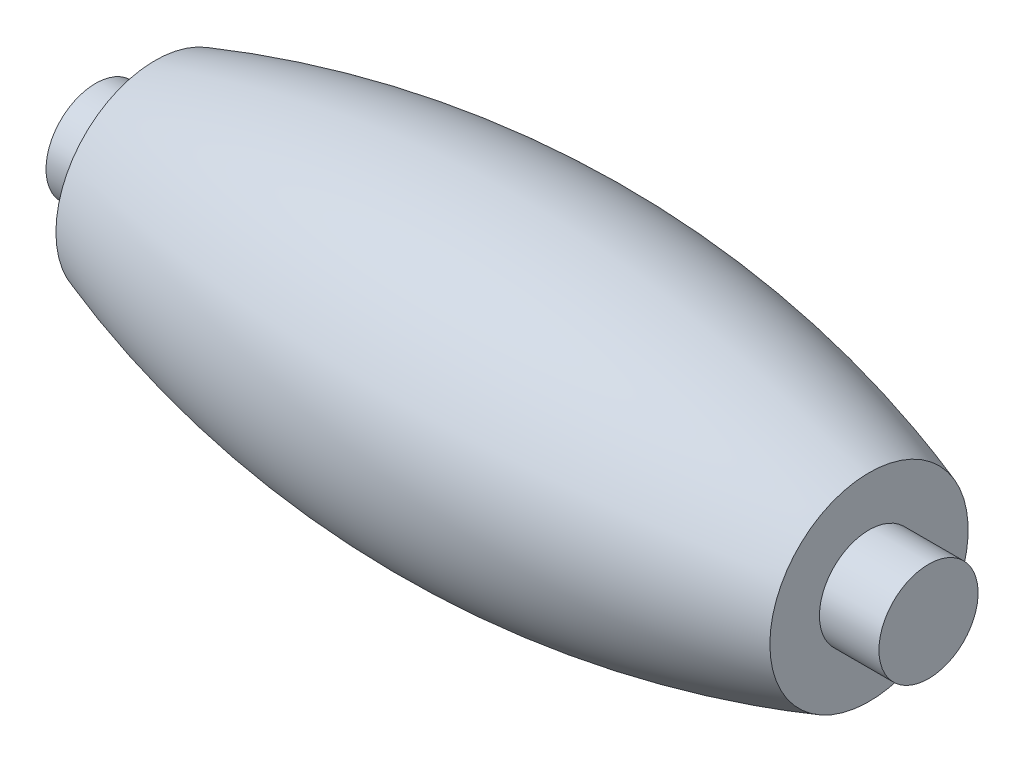
ISO-10303-21;
HEADER;
FILE_DESCRIPTION(('STEP AP214'),'2;1');
FILE_NAME('part.step','',(''),(''),'','','');
FILE_SCHEMA(('AUTOMOTIVE_DESIGN { 1 0 10303 214 1 1 1 1 }'));
ENDSEC;
DATA;
#1=APPLICATION_CONTEXT('core data for automotive mechanical design processes');
#2=APPLICATION_PROTOCOL_DEFINITION('international standard','automotive_design',2000,#1);
#3=PRODUCT_CONTEXT('',#1,'mechanical');
#4=PRODUCT('Part','Part','',(#3));
#5=PRODUCT_RELATED_PRODUCT_CATEGORY('part','',(#4));
#6=PRODUCT_DEFINITION_FORMATION('','',#4);
#7=PRODUCT_DEFINITION_CONTEXT('part definition',#1,'design');
#8=PRODUCT_DEFINITION('design','',#6,#7);
#9=PRODUCT_DEFINITION_SHAPE('','',#8);
#10=(LENGTH_UNIT() NAMED_UNIT(*) SI_UNIT(.MILLI.,.METRE.));
#11=(NAMED_UNIT(*) PLANE_ANGLE_UNIT() SI_UNIT($,.RADIAN.));
#12=(NAMED_UNIT(*) SI_UNIT($,.STERADIAN.) SOLID_ANGLE_UNIT());
#13=UNCERTAINTY_MEASURE_WITH_UNIT(LENGTH_MEASURE(1.E-05),#10,'distance_accuracy_value','');
#14=(GEOMETRIC_REPRESENTATION_CONTEXT(3) GLOBAL_UNCERTAINTY_ASSIGNED_CONTEXT((#13)) GLOBAL_UNIT_ASSIGNED_CONTEXT((#10,
#11,#12)) REPRESENTATION_CONTEXT('',''));
#15=CARTESIAN_POINT('',(0.,0.,0.));
#16=DIRECTION('',(0.,0.,1.));
#17=DIRECTION('',(1.,0.,0.));
#18=AXIS2_PLACEMENT_3D('',#15,#16,#17);
#19=CARTESIAN_POINT('',(0.,0.,0.));
#20=DIRECTION('',(1.,0.,0.));
#21=DIRECTION('',(0.,0.,-1.));
#22=AXIS2_PLACEMENT_3D('',#19,#20,#21);
#23=PLANE('',#22);
#24=CARTESIAN_POINT('',(0.,0.,0.));
#25=DIRECTION('',(-1.,0.,0.));
#26=DIRECTION('',(0.,0.,1.));
#27=AXIS2_PLACEMENT_3D('',#24,#25,#26);
#28=CIRCLE('',#27,2.5);
#29=CARTESIAN_POINT('',(0.,0.,2.5));
#30=VERTEX_POINT('',#29);
#31=EDGE_CURVE('E10',#30,#30,#28,.T.);
#32=ORIENTED_EDGE('',*,*,#31,.T.);
#33=EDGE_LOOP('',(#32));
#34=FACE_BOUND('',#33,.T.);
#35=ADVANCED_FACE('F39',(#34),#23,.F.);
#36=CARTESIAN_POINT('',(0.,0.,0.));
#37=DIRECTION('',(-1.,0.,0.));
#38=DIRECTION('',(0.,0.,1.));
#39=AXIS2_PLACEMENT_3D('',#36,#37,#38);
#40=CYLINDRICAL_SURFACE('',#39,2.5);
#41=ORIENTED_EDGE('',*,*,#31,.F.);
#42=EDGE_LOOP('',(#41));
#43=FACE_BOUND('',#42,.T.);
#44=CARTESIAN_POINT('',(3.,0.,0.));
#45=DIRECTION('',(-1.,0.,0.));
#46=DIRECTION('',(0.,0.,1.));
#47=AXIS2_PLACEMENT_3D('',#44,#45,#46);
#48=CIRCLE('',#47,2.5);
#49=CARTESIAN_POINT('',(3.,0.,2.5));
#50=VERTEX_POINT('',#49);
#51=EDGE_CURVE('E46',#50,#50,#48,.T.);
#52=ORIENTED_EDGE('',*,*,#51,.T.);
#53=EDGE_LOOP('',(#52));
#54=FACE_BOUND('',#53,.T.);
#55=ADVANCED_FACE('F83',(#43,#54),#40,.T.);
#56=CARTESIAN_POINT('',(3.,0.,-2.5));
#57=DIRECTION('',(1.,0.,0.));
#58=DIRECTION('',(0.,0.,-1.));
#59=AXIS2_PLACEMENT_3D('',#56,#57,#58);
#60=PLANE('',#59);
#61=ORIENTED_EDGE('',*,*,#51,.F.);
#62=EDGE_LOOP('',(#61));
#63=FACE_BOUND('',#62,.T.);
#64=CARTESIAN_POINT('',(3.,0.,0.));
#65=DIRECTION('',(-1.,0.,0.));
#66=DIRECTION('',(0.,0.,1.));
#67=AXIS2_PLACEMENT_3D('',#64,#65,#66);
#68=CIRCLE('',#67,5.);
#69=CARTESIAN_POINT('',(3.,0.,5.));
#70=VERTEX_POINT('',#69);
#71=EDGE_CURVE('E51',#70,#70,#68,.T.);
#72=ORIENTED_EDGE('',*,*,#71,.T.);
#73=EDGE_LOOP('',(#72));
#74=FACE_BOUND('',#73,.T.);
#75=ADVANCED_FACE('F87',(#63,#74),#60,.F.);
#76=CARTESIAN_POINT('',(21.,0.,0.));
#77=DIRECTION('',(-1.,0.,0.));
#78=DIRECTION('',(0.,0.,1.));
#79=AXIS2_PLACEMENT_3D('',#76,#77,#78);
#80=DEGENERATE_TOROIDAL_SURFACE('',#79,47.3352766397452,55.3442063901783,.F.);
#81=ORIENTED_EDGE('',*,*,#71,.F.);
#82=EDGE_LOOP('',(#81));
#83=FACE_BOUND('',#82,.T.);
#84=CARTESIAN_POINT('',(39.,0.,0.));
#85=DIRECTION('',(-1.,0.,0.));
#86=DIRECTION('',(0.,0.,1.));
#87=AXIS2_PLACEMENT_3D('',#84,#85,#86);
#88=CIRCLE('',#87,5.);
#89=CARTESIAN_POINT('',(39.,0.,5.));
#90=VERTEX_POINT('',#89);
#91=EDGE_CURVE('E56',#90,#90,#88,.T.);
#92=ORIENTED_EDGE('',*,*,#91,.T.);
#93=EDGE_LOOP('',(#92));
#94=FACE_BOUND('',#93,.T.);
#95=ADVANCED_FACE('F92',(#83,#94),#80,.F.);
#96=CARTESIAN_POINT('',(39.,0.,-2.5));
#97=DIRECTION('',(-1.,0.,0.));
#98=DIRECTION('',(0.,0.,1.));
#99=AXIS2_PLACEMENT_3D('',#96,#97,#98);
#100=PLANE('',#99);
#101=ORIENTED_EDGE('',*,*,#91,.F.);
#102=EDGE_LOOP('',(#101));
#103=FACE_BOUND('',#102,.T.);
#104=CARTESIAN_POINT('',(39.,0.,0.));
#105=DIRECTION('',(-1.,0.,0.));
#106=DIRECTION('',(0.,0.,1.));
#107=AXIS2_PLACEMENT_3D('',#104,#105,#106);
#108=CIRCLE('',#107,2.5);
#109=CARTESIAN_POINT('',(39.,0.,2.5));
#110=VERTEX_POINT('',#109);
#111=EDGE_CURVE('E62',#110,#110,#108,.T.);
#112=ORIENTED_EDGE('',*,*,#111,.T.);
#113=EDGE_LOOP('',(#112));
#114=FACE_BOUND('',#113,.T.);
#115=ADVANCED_FACE('F79',(#103,#114),#100,.F.);
#116=CARTESIAN_POINT('',(0.,0.,0.));
#117=DIRECTION('',(-1.,0.,0.));
#118=DIRECTION('',(0.,0.,1.));
#119=AXIS2_PLACEMENT_3D('',#116,#117,#118);
#120=CYLINDRICAL_SURFACE('',#119,2.5);
#121=ORIENTED_EDGE('',*,*,#111,.F.);
#122=EDGE_LOOP('',(#121));
#123=FACE_BOUND('',#122,.T.);
#124=CARTESIAN_POINT('',(42.,0.,0.));
#125=DIRECTION('',(-1.,0.,0.));
#126=DIRECTION('',(0.,0.,1.));
#127=AXIS2_PLACEMENT_3D('',#124,#125,#126);
#128=CIRCLE('',#127,2.5);
#129=CARTESIAN_POINT('',(42.,0.,2.5));
#130=VERTEX_POINT('',#129);
#131=EDGE_CURVE('E66',#130,#130,#128,.T.);
#132=ORIENTED_EDGE('',*,*,#131,.T.);
#133=EDGE_LOOP('',(#132));
#134=FACE_BOUND('',#133,.T.);
#135=ADVANCED_FACE('F71',(#123,#134),#120,.T.);
#136=CARTESIAN_POINT('',(42.,0.,0.));
#137=DIRECTION('',(-1.,0.,0.));
#138=DIRECTION('',(0.,0.,1.));
#139=AXIS2_PLACEMENT_3D('',#136,#137,#138);
#140=PLANE('',#139);
#141=ORIENTED_EDGE('',*,*,#131,.F.);
#142=EDGE_LOOP('',(#141));
#143=FACE_BOUND('',#142,.T.);
#144=ADVANCED_FACE('F73',(#143),#140,.F.);
#145=CLOSED_SHELL('',(#35,#55,#75,#95,#115,#135,#144));
#146=MANIFOLD_SOLID_BREP('B2',#145);
#147=ADVANCED_BREP_SHAPE_REPRESENTATION('',(#18,#146),#14);
#148=SHAPE_DEFINITION_REPRESENTATION(#9,#147);
ENDSEC;
END-ISO-10303-21;
